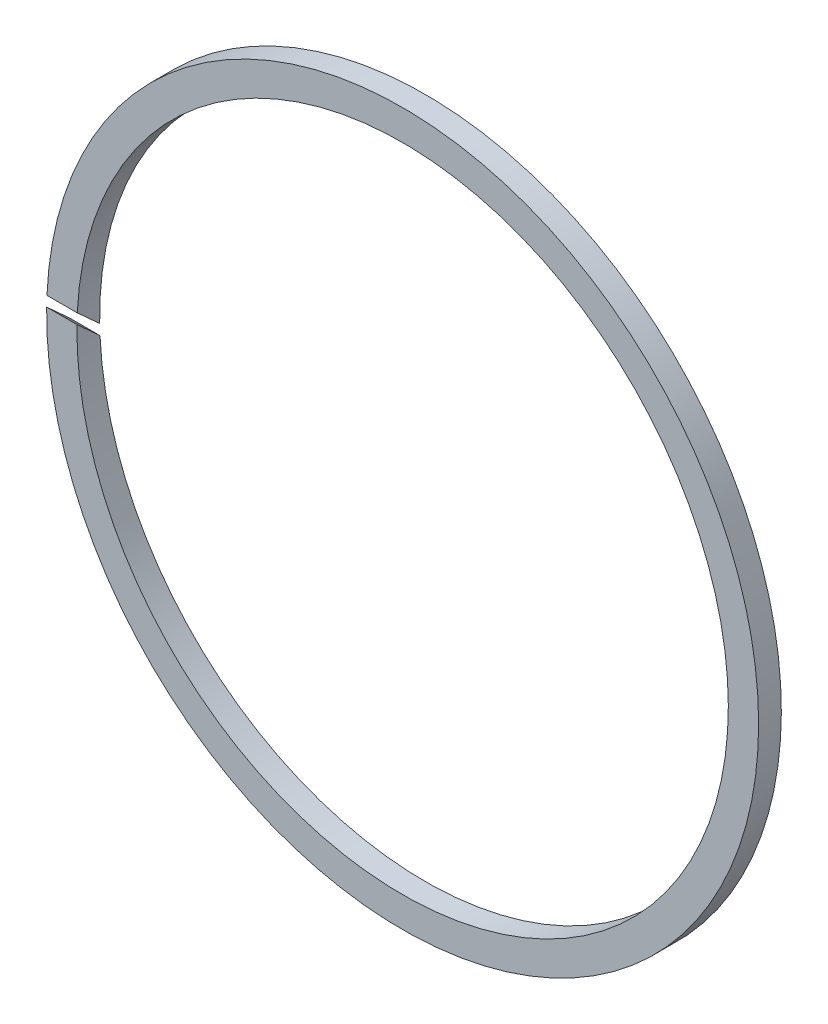
ISO-10303-21;
HEADER;
FILE_DESCRIPTION(('STEP AP214'),'2;1');
FILE_NAME('part.step','',(''),(''),'','','');
FILE_SCHEMA(('AUTOMOTIVE_DESIGN { 1 0 10303 214 1 1 1 1 }'));
ENDSEC;
DATA;
#1=APPLICATION_CONTEXT('core data for automotive mechanical design processes');
#2=APPLICATION_PROTOCOL_DEFINITION('international standard','automotive_design',2000,#1);
#3=PRODUCT_CONTEXT('',#1,'mechanical');
#4=PRODUCT('Part','Part','',(#3));
#5=PRODUCT_RELATED_PRODUCT_CATEGORY('part','',(#4));
#6=PRODUCT_DEFINITION_FORMATION('','',#4);
#7=PRODUCT_DEFINITION_CONTEXT('part definition',#1,'design');
#8=PRODUCT_DEFINITION('design','',#6,#7);
#9=PRODUCT_DEFINITION_SHAPE('','',#8);
#10=(LENGTH_UNIT() NAMED_UNIT(*) SI_UNIT(.MILLI.,.METRE.));
#11=(NAMED_UNIT(*) PLANE_ANGLE_UNIT() SI_UNIT($,.RADIAN.));
#12=(NAMED_UNIT(*) SI_UNIT($,.STERADIAN.) SOLID_ANGLE_UNIT());
#13=UNCERTAINTY_MEASURE_WITH_UNIT(LENGTH_MEASURE(1.E-05),#10,'distance_accuracy_value','');
#14=(GEOMETRIC_REPRESENTATION_CONTEXT(3) GLOBAL_UNCERTAINTY_ASSIGNED_CONTEXT((#13)) GLOBAL_UNIT_ASSIGNED_CONTEXT((#10,
#11,#12)) REPRESENTATION_CONTEXT('',''));
#15=CARTESIAN_POINT('',(0.,0.,0.));
#16=DIRECTION('',(0.,0.,1.));
#17=DIRECTION('',(1.,0.,0.));
#18=AXIS2_PLACEMENT_3D('',#15,#16,#17);
#19=CARTESIAN_POINT('',(0.,0.,1.5));
#20=DIRECTION('',(0.,0.,1.));
#21=DIRECTION('',(1.,0.,0.));
#22=AXIS2_PLACEMENT_3D('',#19,#20,#21);
#23=PLANE('',#22);
#24=DIRECTION('',(-1.,0.,0.));
#25=VECTOR('',#24,1.);
#26=CARTESIAN_POINT('',(0.,2.04585111548123,1.5));
#27=LINE('',#26,#25);
#28=CARTESIAN_POINT('',(-42.9513037428817,2.04585111548123,1.5));
#29=VERTEX_POINT('',#28);
#30=CARTESIAN_POINT('',(-46.9554522203043,2.04585111548122,1.5));
#31=VERTEX_POINT('',#30);
#32=EDGE_CURVE('E96',#29,#31,#27,.T.);
#33=ORIENTED_EDGE('',*,*,#32,.F.);
#34=CARTESIAN_POINT('',(0.,0.,1.5));
#35=DIRECTION('',(0.,0.,1.));
#36=DIRECTION('',(1.,0.,0.));
#37=AXIS2_PLACEMENT_3D('',#34,#35,#36);
#38=CIRCLE('',#37,43.);
#39=CARTESIAN_POINT('',(-42.9944312447573,0.692012962188674,1.5));
#40=VERTEX_POINT('',#39);
#41=EDGE_CURVE('E92',#40,#29,#38,.T.);
#42=ORIENTED_EDGE('',*,*,#41,.F.);
#43=DIRECTION('',(1.,0.,0.));
#44=VECTOR('',#43,1.);
#45=CARTESIAN_POINT('',(0.,0.692012962188674,1.5));
#46=LINE('',#45,#44);
#47=CARTESIAN_POINT('',(-46.994905235144,0.692012962188674,1.5));
#48=VERTEX_POINT('',#47);
#49=EDGE_CURVE('E59',#48,#40,#46,.T.);
#50=ORIENTED_EDGE('',*,*,#49,.F.);
#51=CARTESIAN_POINT('',(0.,0.,1.5));
#52=DIRECTION('',(0.,0.,1.));
#53=DIRECTION('',(1.,0.,0.));
#54=AXIS2_PLACEMENT_3D('',#51,#52,#53);
#55=CIRCLE('',#54,47.);
#56=EDGE_CURVE('E83',#48,#31,#55,.T.);
#57=ORIENTED_EDGE('',*,*,#56,.T.);
#58=EDGE_LOOP('',(#33,#42,#50,#57));
#59=FACE_BOUND('',#58,.T.);
#60=ADVANCED_FACE('F37',(#59),#23,.T.);
#61=CARTESIAN_POINT('',(0.,0.,-1.5));
#62=DIRECTION('',(0.,0.,1.));
#63=DIRECTION('',(1.,0.,0.));
#64=AXIS2_PLACEMENT_3D('',#61,#62,#63);
#65=PLANE('',#64);
#66=CARTESIAN_POINT('',(0.,0.,-1.5));
#67=DIRECTION('',(0.,0.,1.));
#68=DIRECTION('',(1.,0.,0.));
#69=AXIS2_PLACEMENT_3D('',#66,#67,#68);
#70=CIRCLE('',#69,43.);
#71=CARTESIAN_POINT('',(-42.9513037428817,-2.04585111548123,-1.5));
#72=VERTEX_POINT('',#71);
#73=CARTESIAN_POINT('',(-42.9944312447573,-0.692012962188675,-1.5));
#74=VERTEX_POINT('',#73);
#75=EDGE_CURVE('E87',#72,#74,#70,.T.);
#76=ORIENTED_EDGE('',*,*,#75,.T.);
#77=DIRECTION('',(-1.,0.,0.));
#78=VECTOR('',#77,1.);
#79=CARTESIAN_POINT('',(0.,-0.692012962188676,-1.5));
#80=LINE('',#79,#78);
#81=CARTESIAN_POINT('',(-46.994905235144,-0.692012962188676,-1.5));
#82=VERTEX_POINT('',#81);
#83=EDGE_CURVE('E51',#74,#82,#80,.T.);
#84=ORIENTED_EDGE('',*,*,#83,.T.);
#85=CARTESIAN_POINT('',(0.,0.,-1.5));
#86=DIRECTION('',(0.,0.,1.));
#87=DIRECTION('',(1.,0.,0.));
#88=AXIS2_PLACEMENT_3D('',#85,#86,#87);
#89=CIRCLE('',#88,47.);
#90=CARTESIAN_POINT('',(-46.9554522203043,-2.04585111548123,-1.5));
#91=VERTEX_POINT('',#90);
#92=EDGE_CURVE('E89',#91,#82,#89,.T.);
#93=ORIENTED_EDGE('',*,*,#92,.F.);
#94=DIRECTION('',(1.,0.,0.));
#95=VECTOR('',#94,1.);
#96=CARTESIAN_POINT('',(0.,-2.04585111548123,-1.5));
#97=LINE('',#96,#95);
#98=EDGE_CURVE('E77',#91,#72,#97,.T.);
#99=ORIENTED_EDGE('',*,*,#98,.T.);
#100=EDGE_LOOP('',(#76,#84,#93,#99));
#101=FACE_BOUND('',#100,.T.);
#102=ADVANCED_FACE('F86',(#101),#65,.F.);
#103=CARTESIAN_POINT('',(0.,0.,1.5));
#104=DIRECTION('',(0.,0.,-1.));
#105=DIRECTION('',(-1.,0.,0.));
#106=AXIS2_PLACEMENT_3D('',#103,#104,#105);
#107=CYLINDRICAL_SURFACE('',#106,47.);
#108=ORIENTED_EDGE('',*,*,#92,.T.);
#109=CARTESIAN_POINT('',(0.,0.,-0.74173047760177));
#110=DIRECTION('',(0.,0.738640728633617,-0.6740993057433));
#111=DIRECTION('',(0.,-0.6740993057433,-0.738640728633617));
#112=AXIS2_PLACEMENT_3D('',#109,#110,#111);
#113=ELLIPSE('',#112,69.7226648945664,47.);
#114=EDGE_CURVE('E93',#82,#31,#113,.T.);
#115=ORIENTED_EDGE('',*,*,#114,.T.);
#116=ORIENTED_EDGE('',*,*,#56,.F.);
#117=CARTESIAN_POINT('',(0.,0.,0.741730477601771));
#118=DIRECTION('',(0.,-0.738640728633617,0.6740993057433));
#119=DIRECTION('',(0.,-0.6740993057433,-0.738640728633617));
#120=AXIS2_PLACEMENT_3D('',#117,#118,#119);
#121=ELLIPSE('',#120,69.7226648945664,47.);
#122=EDGE_CURVE('E104',#48,#91,#121,.T.);
#123=ORIENTED_EDGE('',*,*,#122,.T.);
#124=EDGE_LOOP('',(#108,#115,#116,#123));
#125=FACE_BOUND('',#124,.T.);
#126=ADVANCED_FACE('F39',(#125),#107,.T.);
#127=CARTESIAN_POINT('',(0.,0.,1.5));
#128=DIRECTION('',(0.,0.,-1.));
#129=DIRECTION('',(-1.,0.,0.));
#130=AXIS2_PLACEMENT_3D('',#127,#128,#129);
#131=CYLINDRICAL_SURFACE('',#130,43.);
#132=CARTESIAN_POINT('',(0.,0.,-0.74173047760177));
#133=DIRECTION('',(0.,0.738640728633617,-0.6740993057433));
#134=DIRECTION('',(0.,-0.6740993057433,-0.738640728633617));
#135=AXIS2_PLACEMENT_3D('',#132,#133,#134);
#136=ELLIPSE('',#135,63.7888210737523,43.);
#137=EDGE_CURVE('E11',#74,#29,#136,.T.);
#138=ORIENTED_EDGE('',*,*,#137,.F.);
#139=ORIENTED_EDGE('',*,*,#75,.F.);
#140=CARTESIAN_POINT('',(0.,0.,0.741730477601771));
#141=DIRECTION('',(0.,-0.738640728633617,0.6740993057433));
#142=DIRECTION('',(0.,-0.6740993057433,-0.738640728633617));
#143=AXIS2_PLACEMENT_3D('',#140,#141,#142);
#144=ELLIPSE('',#143,63.7888210737523,43.);
#145=EDGE_CURVE('E45',#40,#72,#144,.T.);
#146=ORIENTED_EDGE('',*,*,#145,.F.);
#147=ORIENTED_EDGE('',*,*,#41,.T.);
#148=EDGE_LOOP('',(#138,#139,#146,#147));
#149=FACE_BOUND('',#148,.T.);
#150=ADVANCED_FACE('F91',(#149),#131,.F.);
#151=CARTESIAN_POINT('',(-47.,6.37167269311619,7.72345693920782));
#152=DIRECTION('',(0.,-0.738640728633617,0.6740993057433));
#153=DIRECTION('',(0.,-0.6740993057433,-0.738640728633617));
#154=AXIS2_PLACEMENT_3D('',#151,#152,#153);
#155=PLANE('',#154);
#156=ORIENTED_EDGE('',*,*,#49,.T.);
#157=ORIENTED_EDGE('',*,*,#145,.T.);
#158=ORIENTED_EDGE('',*,*,#98,.F.);
#159=ORIENTED_EDGE('',*,*,#122,.F.);
#160=EDGE_LOOP('',(#156,#157,#158,#159));
#161=FACE_BOUND('',#160,.T.);
#162=ADVANCED_FACE('F76',(#161),#155,.F.);
#163=CARTESIAN_POINT('',(-47.,7.11031342174981,7.04935763346452));
#164=DIRECTION('',(0.,0.738640728633617,-0.6740993057433));
#165=DIRECTION('',(0.,0.6740993057433,0.738640728633617));
#166=AXIS2_PLACEMENT_3D('',#163,#164,#165);
#167=PLANE('',#166);
#168=ORIENTED_EDGE('',*,*,#83,.F.);
#169=ORIENTED_EDGE('',*,*,#137,.T.);
#170=ORIENTED_EDGE('',*,*,#32,.T.);
#171=ORIENTED_EDGE('',*,*,#114,.F.);
#172=EDGE_LOOP('',(#168,#169,#170,#171));
#173=FACE_BOUND('',#172,.T.);
#174=ADVANCED_FACE('F110',(#173),#167,.F.);
#175=CLOSED_SHELL('',(#60,#102,#126,#150,#162,#174));
#176=MANIFOLD_SOLID_BREP('B2',#175);
#177=ADVANCED_BREP_SHAPE_REPRESENTATION('',(#18,#176),#14);
#178=SHAPE_DEFINITION_REPRESENTATION(#9,#177);
ENDSEC;
END-ISO-10303-21;
